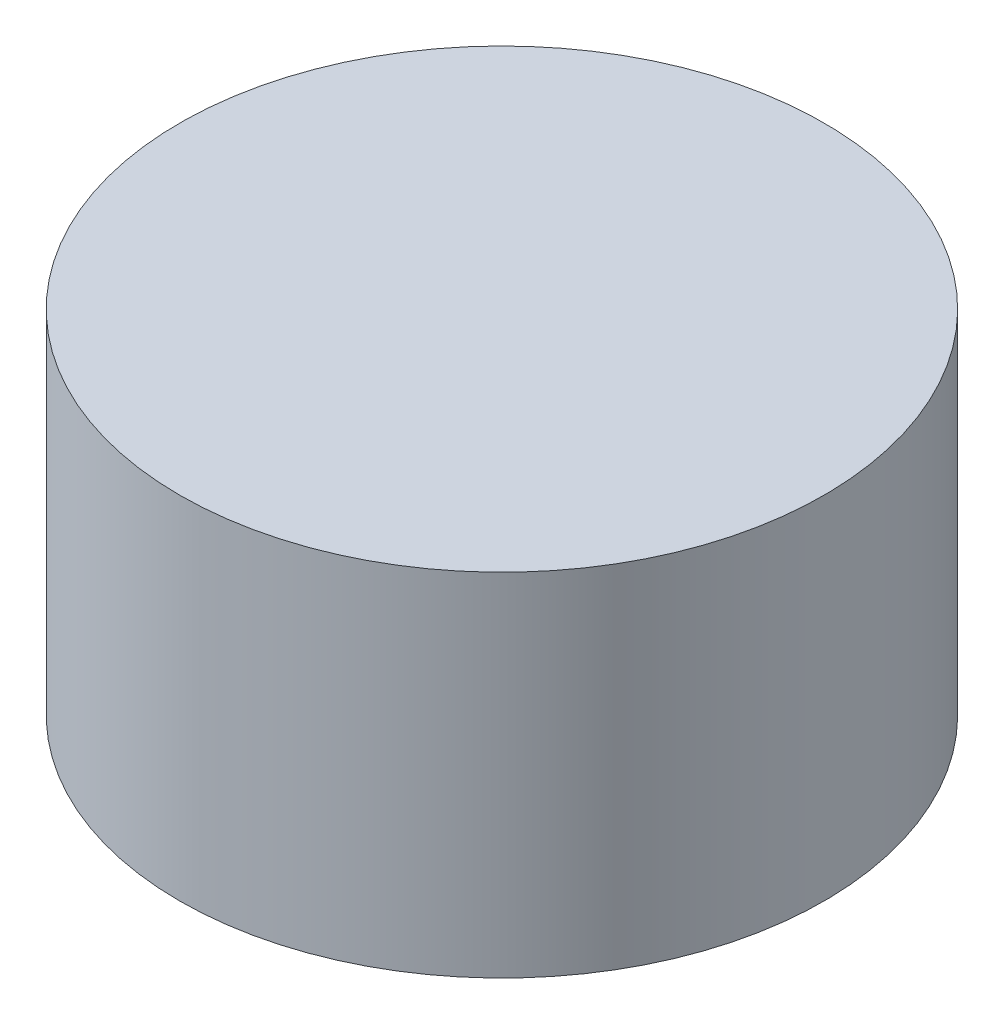
ISO-10303-21;
HEADER;
FILE_DESCRIPTION(('STEP AP214'),'2;1');
FILE_NAME('part.step','',(''),(''),'','','');
FILE_SCHEMA(('AUTOMOTIVE_DESIGN { 1 0 10303 214 1 1 1 1 }'));
ENDSEC;
DATA;
#1=APPLICATION_CONTEXT('core data for automotive mechanical design processes');
#2=APPLICATION_PROTOCOL_DEFINITION('international standard','automotive_design',2000,#1);
#3=PRODUCT_CONTEXT('',#1,'mechanical');
#4=PRODUCT('Part','Part','',(#3));
#5=PRODUCT_RELATED_PRODUCT_CATEGORY('part','',(#4));
#6=PRODUCT_DEFINITION_FORMATION('','',#4);
#7=PRODUCT_DEFINITION_CONTEXT('part definition',#1,'design');
#8=PRODUCT_DEFINITION('design','',#6,#7);
#9=PRODUCT_DEFINITION_SHAPE('','',#8);
#10=(LENGTH_UNIT() NAMED_UNIT(*) SI_UNIT(.MILLI.,.METRE.));
#11=(NAMED_UNIT(*) PLANE_ANGLE_UNIT() SI_UNIT($,.RADIAN.));
#12=(NAMED_UNIT(*) SI_UNIT($,.STERADIAN.) SOLID_ANGLE_UNIT());
#13=UNCERTAINTY_MEASURE_WITH_UNIT(LENGTH_MEASURE(1.E-05),#10,'distance_accuracy_value','');
#14=(GEOMETRIC_REPRESENTATION_CONTEXT(3) GLOBAL_UNCERTAINTY_ASSIGNED_CONTEXT((#13)) GLOBAL_UNIT_ASSIGNED_CONTEXT((#10,
#11,#12)) REPRESENTATION_CONTEXT('',''));
#15=CARTESIAN_POINT('',(0.,0.,0.));
#16=DIRECTION('',(0.,0.,1.));
#17=DIRECTION('',(1.,0.,0.));
#18=AXIS2_PLACEMENT_3D('',#15,#16,#17);
#19=CARTESIAN_POINT('',(0.,40.,0.));
#20=DIRECTION('',(0.,-1.,0.));
#21=DIRECTION('',(0.,0.,-1.));
#22=AXIS2_PLACEMENT_3D('',#19,#20,#21);
#23=CYLINDRICAL_SURFACE('',#22,73.35);
#24=CARTESIAN_POINT('',(0.,40.,0.));
#25=DIRECTION('',(0.,1.,0.));
#26=DIRECTION('',(0.,0.,1.));
#27=AXIS2_PLACEMENT_3D('',#24,#25,#26);
#28=CIRCLE('',#27,73.35);
#29=CARTESIAN_POINT('',(0.,40.,73.35));
#30=VERTEX_POINT('',#29);
#31=EDGE_CURVE('E10',#30,#30,#28,.T.);
#32=ORIENTED_EDGE('',*,*,#31,.F.);
#33=EDGE_LOOP('',(#32));
#34=FACE_BOUND('',#33,.T.);
#35=CARTESIAN_POINT('',(0.,-40.,0.));
#36=DIRECTION('',(0.,1.,0.));
#37=DIRECTION('',(0.,0.,1.));
#38=AXIS2_PLACEMENT_3D('',#35,#36,#37);
#39=CIRCLE('',#38,73.35);
#40=CARTESIAN_POINT('',(0.,-40.,73.35));
#41=VERTEX_POINT('',#40);
#42=EDGE_CURVE('E37',#41,#41,#39,.T.);
#43=ORIENTED_EDGE('',*,*,#42,.T.);
#44=EDGE_LOOP('',(#43));
#45=FACE_BOUND('',#44,.T.);
#46=ADVANCED_FACE('F34',(#34,#45),#23,.T.);
#47=CARTESIAN_POINT('',(0.,40.,0.));
#48=DIRECTION('',(0.,1.,0.));
#49=DIRECTION('',(0.,0.,1.));
#50=AXIS2_PLACEMENT_3D('',#47,#48,#49);
#51=PLANE('',#50);
#52=ORIENTED_EDGE('',*,*,#31,.T.);
#53=EDGE_LOOP('',(#52));
#54=FACE_BOUND('',#53,.T.);
#55=ADVANCED_FACE('F49',(#54),#51,.T.);
#56=CARTESIAN_POINT('',(0.,-40.,0.));
#57=DIRECTION('',(0.,1.,0.));
#58=DIRECTION('',(0.,0.,1.));
#59=AXIS2_PLACEMENT_3D('',#56,#57,#58);
#60=PLANE('',#59);
#61=ORIENTED_EDGE('',*,*,#42,.F.);
#62=EDGE_LOOP('',(#61));
#63=FACE_BOUND('',#62,.T.);
#64=ADVANCED_FACE('F47',(#63),#60,.F.);
#65=CLOSED_SHELL('',(#46,#55,#64));
#66=MANIFOLD_SOLID_BREP('B2',#65);
#67=ADVANCED_BREP_SHAPE_REPRESENTATION('',(#18,#66),#14);
#68=SHAPE_DEFINITION_REPRESENTATION(#9,#67);
ENDSEC;
END-ISO-10303-21;
